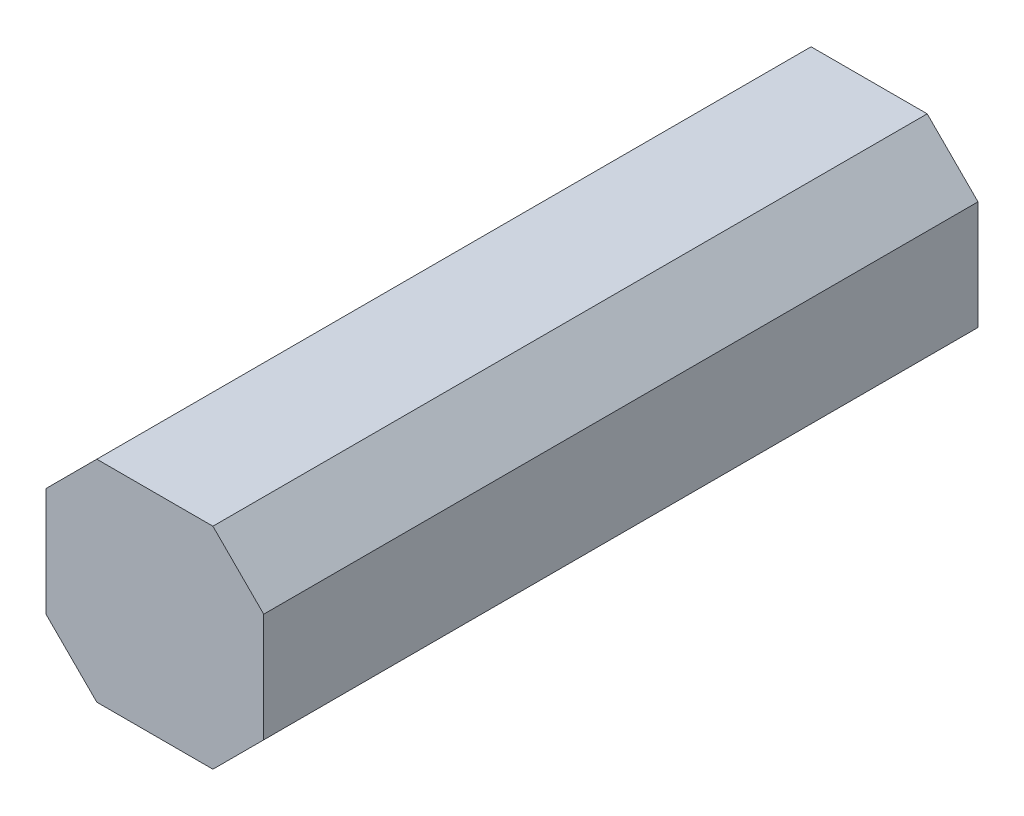
ISO-10303-21;
HEADER;
FILE_DESCRIPTION(('STEP AP214'),'2;1');
FILE_NAME('part.step','',(''),(''),'','','');
FILE_SCHEMA(('AUTOMOTIVE_DESIGN { 1 0 10303 214 1 1 1 1 }'));
ENDSEC;
DATA;
#1=APPLICATION_CONTEXT('core data for automotive mechanical design processes');
#2=APPLICATION_PROTOCOL_DEFINITION('international standard','automotive_design',2000,#1);
#3=PRODUCT_CONTEXT('',#1,'mechanical');
#4=PRODUCT('Part','Part','',(#3));
#5=PRODUCT_RELATED_PRODUCT_CATEGORY('part','',(#4));
#6=PRODUCT_DEFINITION_FORMATION('','',#4);
#7=PRODUCT_DEFINITION_CONTEXT('part definition',#1,'design');
#8=PRODUCT_DEFINITION('design','',#6,#7);
#9=PRODUCT_DEFINITION_SHAPE('','',#8);
#10=(LENGTH_UNIT() NAMED_UNIT(*) SI_UNIT(.MILLI.,.METRE.));
#11=(NAMED_UNIT(*) PLANE_ANGLE_UNIT() SI_UNIT($,.RADIAN.));
#12=(NAMED_UNIT(*) SI_UNIT($,.STERADIAN.) SOLID_ANGLE_UNIT());
#13=UNCERTAINTY_MEASURE_WITH_UNIT(LENGTH_MEASURE(1.E-05),#10,'distance_accuracy_value','');
#14=(GEOMETRIC_REPRESENTATION_CONTEXT(3) GLOBAL_UNCERTAINTY_ASSIGNED_CONTEXT((#13)) GLOBAL_UNIT_ASSIGNED_CONTEXT((#10,
#11,#12)) REPRESENTATION_CONTEXT('',''));
#15=CARTESIAN_POINT('',(0.,0.,0.));
#16=DIRECTION('',(0.,0.,1.));
#17=DIRECTION('',(1.,0.,0.));
#18=AXIS2_PLACEMENT_3D('',#15,#16,#17);
#19=CARTESIAN_POINT('',(-0.2032,-0.3683,0.));
#20=DIRECTION('',(0.,1.,0.));
#21=DIRECTION('',(0.,0.,1.));
#22=AXIS2_PLACEMENT_3D('',#19,#20,#21);
#23=PLANE('',#22);
#24=DIRECTION('',(0.,0.,1.));
#25=VECTOR('',#24,1.);
#26=CARTESIAN_POINT('',(0.2032,-0.3683,0.));
#27=LINE('',#26,#25);
#28=CARTESIAN_POINT('',(0.2032,-0.3683,0.));
#29=VERTEX_POINT('',#28);
#30=CARTESIAN_POINT('',(0.2032,-0.3683,2.50000008));
#31=VERTEX_POINT('',#30);
#32=EDGE_CURVE('E94',#29,#31,#27,.T.);
#33=ORIENTED_EDGE('',*,*,#32,.T.);
#34=DIRECTION('',(1.,0.,0.));
#35=VECTOR('',#34,1.);
#36=CARTESIAN_POINT('',(-0.2032,-0.3683,2.50000008));
#37=LINE('',#36,#35);
#38=CARTESIAN_POINT('',(-0.2032,-0.3683,2.50000008));
#39=VERTEX_POINT('',#38);
#40=EDGE_CURVE('E20',#39,#31,#37,.T.);
#41=ORIENTED_EDGE('',*,*,#40,.F.);
#42=DIRECTION('',(0.,0.,1.));
#43=VECTOR('',#42,1.);
#44=CARTESIAN_POINT('',(-0.2032,-0.3683,0.));
#45=LINE('',#44,#43);
#46=CARTESIAN_POINT('',(-0.2032,-0.3683,0.));
#47=VERTEX_POINT('',#46);
#48=EDGE_CURVE('E104',#39,#47,#45,.F.);
#49=ORIENTED_EDGE('',*,*,#48,.T.);
#50=DIRECTION('',(1.,0.,0.));
#51=VECTOR('',#50,1.);
#52=CARTESIAN_POINT('',(-0.2032,-0.3683,0.));
#53=LINE('',#52,#51);
#54=EDGE_CURVE('E78',#29,#47,#53,.F.);
#55=ORIENTED_EDGE('',*,*,#54,.F.);
#56=EDGE_LOOP('',(#33,#41,#49,#55));
#57=FACE_BOUND('',#56,.T.);
#58=ADVANCED_FACE('F17',(#57),#23,.F.);
#59=CARTESIAN_POINT('',(0.2032,-0.3683,0.));
#60=DIRECTION('',(-0.707106781186548,0.707106781186548,0.));
#61=DIRECTION('',(-0.707106781186548,-0.707106781186548,0.));
#62=AXIS2_PLACEMENT_3D('',#59,#60,#61);
#63=PLANE('',#62);
#64=DIRECTION('',(0.,0.,1.));
#65=VECTOR('',#64,1.);
#66=CARTESIAN_POINT('',(0.381,-0.1905,0.));
#67=LINE('',#66,#65);
#68=CARTESIAN_POINT('',(0.381,-0.1905,0.));
#69=VERTEX_POINT('',#68);
#70=CARTESIAN_POINT('',(0.381,-0.1905,2.50000008));
#71=VERTEX_POINT('',#70);
#72=EDGE_CURVE('E97',#69,#71,#67,.T.);
#73=ORIENTED_EDGE('',*,*,#72,.T.);
#74=DIRECTION('',(-0.707106781186548,-0.707106781186548,0.));
#75=VECTOR('',#74,1.);
#76=CARTESIAN_POINT('',(0.2032,-0.3683,2.50000008));
#77=LINE('',#76,#75);
#78=EDGE_CURVE('E86',#31,#71,#77,.F.);
#79=ORIENTED_EDGE('',*,*,#78,.F.);
#80=ORIENTED_EDGE('',*,*,#32,.F.);
#81=DIRECTION('',(-0.707106781186548,-0.707106781186548,0.));
#82=VECTOR('',#81,1.);
#83=CARTESIAN_POINT('',(0.2032,-0.3683,0.));
#84=LINE('',#83,#82);
#85=EDGE_CURVE('E98',#69,#29,#84,.T.);
#86=ORIENTED_EDGE('',*,*,#85,.F.);
#87=EDGE_LOOP('',(#73,#79,#80,#86));
#88=FACE_BOUND('',#87,.T.);
#89=ADVANCED_FACE('F93',(#88),#63,.F.);
#90=CARTESIAN_POINT('',(-0.381,-0.1905,0.));
#91=DIRECTION('',(0.707106781186548,0.707106781186548,0.));
#92=DIRECTION('',(-0.707106781186548,0.707106781186548,0.));
#93=AXIS2_PLACEMENT_3D('',#90,#91,#92);
#94=PLANE('',#93);
#95=ORIENTED_EDGE('',*,*,#48,.F.);
#96=DIRECTION('',(-0.707106781186548,0.707106781186548,0.));
#97=VECTOR('',#96,1.);
#98=CARTESIAN_POINT('',(-0.381,-0.1905,2.50000008));
#99=LINE('',#98,#97);
#100=CARTESIAN_POINT('',(-0.381,-0.1905,2.50000008));
#101=VERTEX_POINT('',#100);
#102=EDGE_CURVE('E89',#101,#39,#99,.F.);
#103=ORIENTED_EDGE('',*,*,#102,.F.);
#104=DIRECTION('',(0.,0.,-1.));
#105=VECTOR('',#104,1.);
#106=CARTESIAN_POINT('',(-0.381,-0.1905,0.));
#107=LINE('',#106,#105);
#108=CARTESIAN_POINT('',(-0.381,-0.1905,0.));
#109=VERTEX_POINT('',#108);
#110=EDGE_CURVE('E114',#101,#109,#107,.T.);
#111=ORIENTED_EDGE('',*,*,#110,.T.);
#112=DIRECTION('',(-0.707106781186548,0.707106781186548,0.));
#113=VECTOR('',#112,1.);
#114=CARTESIAN_POINT('',(-0.381,-0.1905,0.));
#115=LINE('',#114,#113);
#116=EDGE_CURVE('E106',#47,#109,#115,.T.);
#117=ORIENTED_EDGE('',*,*,#116,.F.);
#118=EDGE_LOOP('',(#95,#103,#111,#117));
#119=FACE_BOUND('',#118,.T.);
#120=ADVANCED_FACE('F176',(#119),#94,.F.);
#121=CARTESIAN_POINT('',(0.381,-0.1905,0.));
#122=DIRECTION('',(-1.,0.,0.));
#123=DIRECTION('',(0.,0.,1.));
#124=AXIS2_PLACEMENT_3D('',#121,#122,#123);
#125=PLANE('',#124);
#126=DIRECTION('',(0.,0.,1.));
#127=VECTOR('',#126,1.);
#128=CARTESIAN_POINT('',(0.381,0.1905,0.));
#129=LINE('',#128,#127);
#130=CARTESIAN_POINT('',(0.381,0.1905,0.));
#131=VERTEX_POINT('',#130);
#132=CARTESIAN_POINT('',(0.381,0.1905,2.50000008));
#133=VERTEX_POINT('',#132);
#134=EDGE_CURVE('E119',#131,#133,#129,.T.);
#135=ORIENTED_EDGE('',*,*,#134,.T.);
#136=DIRECTION('',(0.,1.,0.));
#137=VECTOR('',#136,1.);
#138=CARTESIAN_POINT('',(0.381,-0.1905,2.50000008));
#139=LINE('',#138,#137);
#140=EDGE_CURVE('E109',#71,#133,#139,.T.);
#141=ORIENTED_EDGE('',*,*,#140,.F.);
#142=ORIENTED_EDGE('',*,*,#72,.F.);
#143=DIRECTION('',(0.,1.,0.));
#144=VECTOR('',#143,1.);
#145=CARTESIAN_POINT('',(0.381,-0.1905,0.));
#146=LINE('',#145,#144);
#147=EDGE_CURVE('E111',#131,#69,#146,.F.);
#148=ORIENTED_EDGE('',*,*,#147,.F.);
#149=EDGE_LOOP('',(#135,#141,#142,#148));
#150=FACE_BOUND('',#149,.T.);
#151=ADVANCED_FACE('F172',(#150),#125,.F.);
#152=CARTESIAN_POINT('',(-0.381,0.1905,0.));
#153=DIRECTION('',(1.,0.,0.));
#154=DIRECTION('',(0.,0.,-1.));
#155=AXIS2_PLACEMENT_3D('',#152,#153,#154);
#156=PLANE('',#155);
#157=ORIENTED_EDGE('',*,*,#110,.F.);
#158=DIRECTION('',(0.,1.,0.));
#159=VECTOR('',#158,1.);
#160=CARTESIAN_POINT('',(-0.381,0.3683,2.50000008));
#161=LINE('',#160,#159);
#162=CARTESIAN_POINT('',(-0.381,0.1905,2.50000008));
#163=VERTEX_POINT('',#162);
#164=EDGE_CURVE('E125',#101,#163,#161,.T.);
#165=ORIENTED_EDGE('',*,*,#164,.T.);
#166=DIRECTION('',(0.,0.,1.));
#167=VECTOR('',#166,1.);
#168=CARTESIAN_POINT('',(-0.381,0.1905,0.));
#169=LINE('',#168,#167);
#170=CARTESIAN_POINT('',(-0.381,0.1905,0.));
#171=VERTEX_POINT('',#170);
#172=EDGE_CURVE('E129',#163,#171,#169,.F.);
#173=ORIENTED_EDGE('',*,*,#172,.T.);
#174=DIRECTION('',(0.,1.,0.));
#175=VECTOR('',#174,1.);
#176=CARTESIAN_POINT('',(-0.381,0.1905,0.));
#177=LINE('',#176,#175);
#178=EDGE_CURVE('E117',#109,#171,#177,.T.);
#179=ORIENTED_EDGE('',*,*,#178,.F.);
#180=EDGE_LOOP('',(#157,#165,#173,#179));
#181=FACE_BOUND('',#180,.T.);
#182=ADVANCED_FACE('F169',(#181),#156,.F.);
#183=CARTESIAN_POINT('',(0.381,0.1905,0.));
#184=DIRECTION('',(-0.707106781186548,-0.707106781186548,0.));
#185=DIRECTION('',(0.707106781186548,-0.707106781186548,0.));
#186=AXIS2_PLACEMENT_3D('',#183,#184,#185);
#187=PLANE('',#186);
#188=DIRECTION('',(0.,0.,-1.));
#189=VECTOR('',#188,1.);
#190=CARTESIAN_POINT('',(0.2032,0.3683,0.));
#191=LINE('',#190,#189);
#192=CARTESIAN_POINT('',(0.2032,0.3683,0.));
#193=VERTEX_POINT('',#192);
#194=CARTESIAN_POINT('',(0.2032,0.3683,2.50000008));
#195=VERTEX_POINT('',#194);
#196=EDGE_CURVE('E136',#193,#195,#191,.F.);
#197=ORIENTED_EDGE('',*,*,#196,.T.);
#198=DIRECTION('',(0.707106781186548,-0.707106781186548,0.));
#199=VECTOR('',#198,1.);
#200=CARTESIAN_POINT('',(0.2032,0.3683,2.50000008));
#201=LINE('',#200,#199);
#202=EDGE_CURVE('E122',#195,#133,#201,.T.);
#203=ORIENTED_EDGE('',*,*,#202,.T.);
#204=ORIENTED_EDGE('',*,*,#134,.F.);
#205=DIRECTION('',(0.707106781186548,-0.707106781186548,0.));
#206=VECTOR('',#205,1.);
#207=CARTESIAN_POINT('',(0.2032,0.3683,0.));
#208=LINE('',#207,#206);
#209=EDGE_CURVE('E132',#193,#131,#208,.T.);
#210=ORIENTED_EDGE('',*,*,#209,.F.);
#211=EDGE_LOOP('',(#197,#203,#204,#210));
#212=FACE_BOUND('',#211,.T.);
#213=ADVANCED_FACE('F152',(#212),#187,.F.);
#214=CARTESIAN_POINT('',(0.2032,0.3683,2.50000008));
#215=DIRECTION('',(0.,0.,-1.));
#216=DIRECTION('',(-1.,0.,0.));
#217=AXIS2_PLACEMENT_3D('',#214,#215,#216);
#218=PLANE('',#217);
#219=DIRECTION('',(0.707106781186548,0.707106781186548,0.));
#220=VECTOR('',#219,1.);
#221=CARTESIAN_POINT('',(-0.2032,0.3683,2.50000008));
#222=LINE('',#221,#220);
#223=CARTESIAN_POINT('',(-0.2032,0.3683,2.50000008));
#224=VERTEX_POINT('',#223);
#225=EDGE_CURVE('E127',#224,#163,#222,.F.);
#226=ORIENTED_EDGE('',*,*,#225,.T.);
#227=ORIENTED_EDGE('',*,*,#164,.F.);
#228=ORIENTED_EDGE('',*,*,#102,.T.);
#229=ORIENTED_EDGE('',*,*,#40,.T.);
#230=ORIENTED_EDGE('',*,*,#78,.T.);
#231=ORIENTED_EDGE('',*,*,#140,.T.);
#232=ORIENTED_EDGE('',*,*,#202,.F.);
#233=DIRECTION('',(1.,0.,0.));
#234=VECTOR('',#233,1.);
#235=CARTESIAN_POINT('',(0.2032,0.3683,2.50000008));
#236=LINE('',#235,#234);
#237=EDGE_CURVE('E139',#195,#224,#236,.F.);
#238=ORIENTED_EDGE('',*,*,#237,.T.);
#239=EDGE_LOOP('',(#226,#227,#228,#229,#230,#231,#232,#238));
#240=FACE_BOUND('',#239,.T.);
#241=ADVANCED_FACE('F85',(#240),#218,.F.);
#242=CARTESIAN_POINT('',(-0.2032,0.3683,0.));
#243=DIRECTION('',(0.707106781186548,-0.707106781186548,0.));
#244=DIRECTION('',(0.707106781186548,0.707106781186548,0.));
#245=AXIS2_PLACEMENT_3D('',#242,#243,#244);
#246=PLANE('',#245);
#247=ORIENTED_EDGE('',*,*,#172,.F.);
#248=ORIENTED_EDGE('',*,*,#225,.F.);
#249=DIRECTION('',(0.,0.,-1.));
#250=VECTOR('',#249,1.);
#251=CARTESIAN_POINT('',(-0.2032,0.3683,0.));
#252=LINE('',#251,#250);
#253=CARTESIAN_POINT('',(-0.2032,0.3683,0.));
#254=VERTEX_POINT('',#253);
#255=EDGE_CURVE('E26',#224,#254,#252,.T.);
#256=ORIENTED_EDGE('',*,*,#255,.T.);
#257=DIRECTION('',(0.707106781186548,0.707106781186548,0.));
#258=VECTOR('',#257,1.);
#259=CARTESIAN_POINT('',(-0.381,0.1905,0.));
#260=LINE('',#259,#258);
#261=EDGE_CURVE('E34',#171,#254,#260,.T.);
#262=ORIENTED_EDGE('',*,*,#261,.F.);
#263=EDGE_LOOP('',(#247,#248,#256,#262));
#264=FACE_BOUND('',#263,.T.);
#265=ADVANCED_FACE('F146',(#264),#246,.F.);
#266=CARTESIAN_POINT('',(0.2032,0.3683,0.));
#267=DIRECTION('',(0.,0.,-1.));
#268=DIRECTION('',(-1.,0.,0.));
#269=AXIS2_PLACEMENT_3D('',#266,#267,#268);
#270=PLANE('',#269);
#271=ORIENTED_EDGE('',*,*,#261,.T.);
#272=DIRECTION('',(1.,0.,0.));
#273=VECTOR('',#272,1.);
#274=CARTESIAN_POINT('',(0.2032,0.3683,0.));
#275=LINE('',#274,#273);
#276=EDGE_CURVE('E11',#254,#193,#275,.T.);
#277=ORIENTED_EDGE('',*,*,#276,.T.);
#278=ORIENTED_EDGE('',*,*,#209,.T.);
#279=ORIENTED_EDGE('',*,*,#147,.T.);
#280=ORIENTED_EDGE('',*,*,#85,.T.);
#281=ORIENTED_EDGE('',*,*,#54,.T.);
#282=ORIENTED_EDGE('',*,*,#116,.T.);
#283=ORIENTED_EDGE('',*,*,#178,.T.);
#284=EDGE_LOOP('',(#271,#277,#278,#279,#280,#281,#282,#283));
#285=FACE_BOUND('',#284,.T.);
#286=ADVANCED_FACE('F154',(#285),#270,.T.);
#287=CARTESIAN_POINT('',(0.2032,0.3683,0.));
#288=DIRECTION('',(0.,-1.,0.));
#289=DIRECTION('',(0.,0.,-1.));
#290=AXIS2_PLACEMENT_3D('',#287,#288,#289);
#291=PLANE('',#290);
#292=ORIENTED_EDGE('',*,*,#255,.F.);
#293=ORIENTED_EDGE('',*,*,#237,.F.);
#294=ORIENTED_EDGE('',*,*,#196,.F.);
#295=ORIENTED_EDGE('',*,*,#276,.F.);
#296=EDGE_LOOP('',(#292,#293,#294,#295));
#297=FACE_BOUND('',#296,.T.);
#298=ADVANCED_FACE('F149',(#297),#291,.F.);
#299=CLOSED_SHELL('',(#58,#89,#120,#151,#182,#213,#241,#265,#286,#298));
#300=MANIFOLD_SOLID_BREP('B1',#299);
#301=ADVANCED_BREP_SHAPE_REPRESENTATION('',(#18,#300),#14);
#302=SHAPE_DEFINITION_REPRESENTATION(#9,#301);
ENDSEC;
END-ISO-10303-21;
